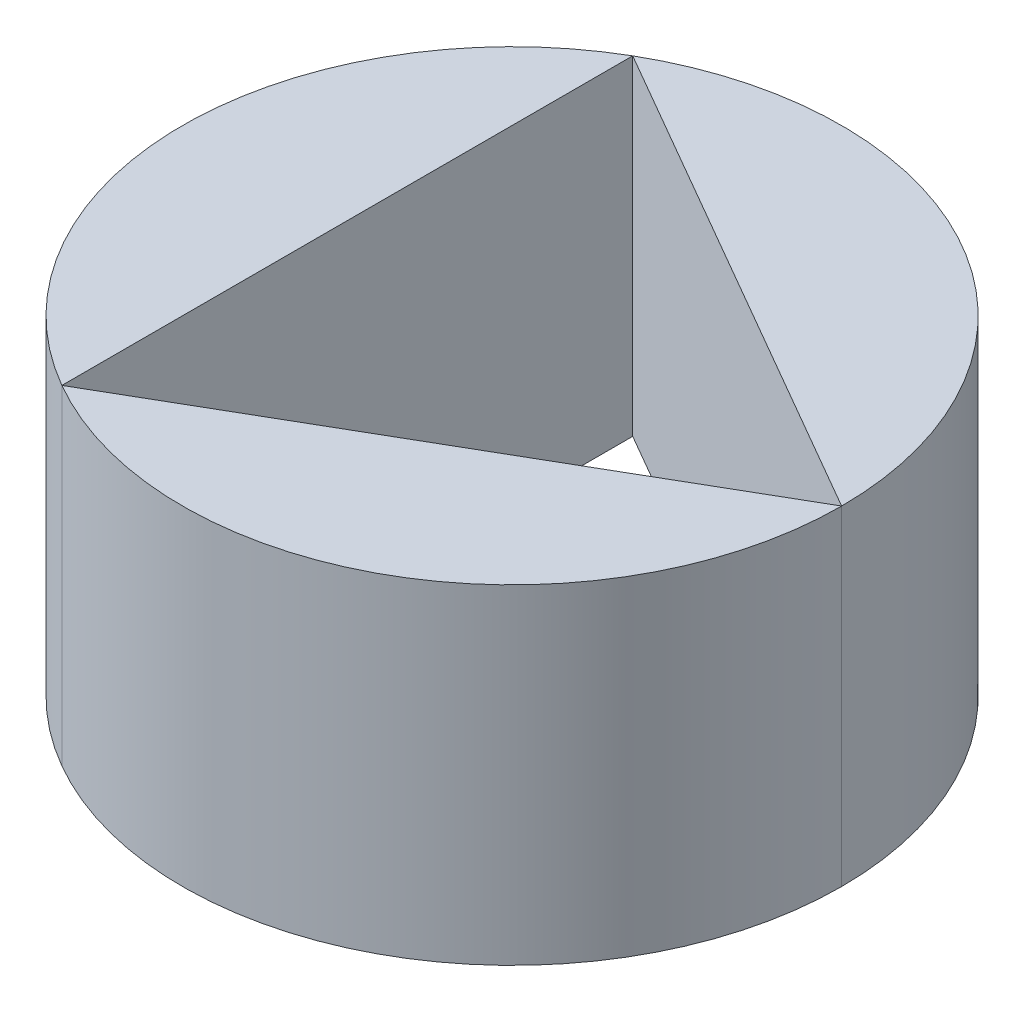
ISO-10303-21;
HEADER;
FILE_DESCRIPTION(('STEP AP214'),'2;1');
FILE_NAME('part.step','',(''),(''),'','','');
FILE_SCHEMA(('AUTOMOTIVE_DESIGN { 1 0 10303 214 1 1 1 1 }'));
ENDSEC;
DATA;
#1=APPLICATION_CONTEXT('core data for automotive mechanical design processes');
#2=APPLICATION_PROTOCOL_DEFINITION('international standard','automotive_design',2000,#1);
#3=PRODUCT_CONTEXT('',#1,'mechanical');
#4=PRODUCT('Part','Part','',(#3));
#5=PRODUCT_RELATED_PRODUCT_CATEGORY('part','',(#4));
#6=PRODUCT_DEFINITION_FORMATION('','',#4);
#7=PRODUCT_DEFINITION_CONTEXT('part definition',#1,'design');
#8=PRODUCT_DEFINITION('design','',#6,#7);
#9=PRODUCT_DEFINITION_SHAPE('','',#8);
#10=(LENGTH_UNIT() NAMED_UNIT(*) SI_UNIT(.MILLI.,.METRE.));
#11=(NAMED_UNIT(*) PLANE_ANGLE_UNIT() SI_UNIT($,.RADIAN.));
#12=(NAMED_UNIT(*) SI_UNIT($,.STERADIAN.) SOLID_ANGLE_UNIT());
#13=UNCERTAINTY_MEASURE_WITH_UNIT(LENGTH_MEASURE(1.E-05),#10,'distance_accuracy_value','');
#14=(GEOMETRIC_REPRESENTATION_CONTEXT(3) GLOBAL_UNCERTAINTY_ASSIGNED_CONTEXT((#13)) GLOBAL_UNIT_ASSIGNED_CONTEXT((#10,
#11,#12)) REPRESENTATION_CONTEXT('',''));
#15=CARTESIAN_POINT('',(0.,0.,0.));
#16=DIRECTION('',(0.,0.,1.));
#17=DIRECTION('',(1.,0.,0.));
#18=AXIS2_PLACEMENT_3D('',#15,#16,#17);
#19=CARTESIAN_POINT('',(0.,30.,0.));
#20=DIRECTION('',(0.,-1.,0.));
#21=DIRECTION('',(0.,0.,-1.));
#22=AXIS2_PLACEMENT_3D('',#19,#20,#21);
#23=CYLINDRICAL_SURFACE('',#22,30.);
#24=DIRECTION('',(0.,1.,0.));
#25=VECTOR('',#24,1.);
#26=CARTESIAN_POINT('',(-15.,0.,25.9807621135332));
#27=LINE('',#26,#25);
#28=CARTESIAN_POINT('',(-15.,0.,25.9807621135332));
#29=VERTEX_POINT('',#28);
#30=CARTESIAN_POINT('',(-15.,30.,25.9807621135332));
#31=VERTEX_POINT('',#30);
#32=EDGE_CURVE('E12',#29,#31,#27,.T.);
#33=ORIENTED_EDGE('',*,*,#32,.F.);
#34=CARTESIAN_POINT('',(0.,0.,0.));
#35=DIRECTION('',(0.,1.,0.));
#36=DIRECTION('',(0.,0.,1.));
#37=AXIS2_PLACEMENT_3D('',#34,#35,#36);
#38=CIRCLE('',#37,30.);
#39=CARTESIAN_POINT('',(30.,0.,0.));
#40=VERTEX_POINT('',#39);
#41=EDGE_CURVE('E80',#29,#40,#38,.T.);
#42=ORIENTED_EDGE('',*,*,#41,.T.);
#43=DIRECTION('',(0.,1.,0.));
#44=VECTOR('',#43,1.);
#45=CARTESIAN_POINT('',(30.,0.,0.));
#46=LINE('',#45,#44);
#47=CARTESIAN_POINT('',(30.,30.,0.));
#48=VERTEX_POINT('',#47);
#49=EDGE_CURVE('E72',#40,#48,#46,.T.);
#50=ORIENTED_EDGE('',*,*,#49,.T.);
#51=CARTESIAN_POINT('',(0.,30.,0.));
#52=DIRECTION('',(0.,1.,0.));
#53=DIRECTION('',(0.,0.,1.));
#54=AXIS2_PLACEMENT_3D('',#51,#52,#53);
#55=CIRCLE('',#54,30.);
#56=EDGE_CURVE('E51',#31,#48,#55,.T.);
#57=ORIENTED_EDGE('',*,*,#56,.F.);
#58=EDGE_LOOP('',(#33,#42,#50,#57));
#59=FACE_BOUND('',#58,.T.);
#60=ADVANCED_FACE('F48',(#59),#23,.T.);
#61=CARTESIAN_POINT('',(0.,30.,0.));
#62=DIRECTION('',(0.,1.,0.));
#63=DIRECTION('',(0.,0.,1.));
#64=AXIS2_PLACEMENT_3D('',#61,#62,#63);
#65=PLANE('',#64);
#66=DIRECTION('',(0.866025403784439,0.,-0.5));
#67=VECTOR('',#66,1.);
#68=CARTESIAN_POINT('',(-15.,30.,25.9807621135332));
#69=LINE('',#68,#67);
#70=EDGE_CURVE('E57',#31,#48,#69,.T.);
#71=ORIENTED_EDGE('',*,*,#70,.F.);
#72=ORIENTED_EDGE('',*,*,#56,.T.);
#73=EDGE_LOOP('',(#71,#72));
#74=FACE_BOUND('',#73,.T.);
#75=ADVANCED_FACE('F83',(#74),#65,.T.);
#76=CARTESIAN_POINT('',(0.,0.,0.));
#77=DIRECTION('',(0.,1.,0.));
#78=DIRECTION('',(0.,0.,1.));
#79=AXIS2_PLACEMENT_3D('',#76,#77,#78);
#80=PLANE('',#79);
#81=ORIENTED_EDGE('',*,*,#41,.F.);
#82=DIRECTION('',(0.866025403784439,0.,-0.5));
#83=VECTOR('',#82,1.);
#84=CARTESIAN_POINT('',(-15.,0.,25.9807621135332));
#85=LINE('',#84,#83);
#86=EDGE_CURVE('E76',#29,#40,#85,.T.);
#87=ORIENTED_EDGE('',*,*,#86,.T.);
#88=EDGE_LOOP('',(#81,#87));
#89=FACE_BOUND('',#88,.T.);
#90=ADVANCED_FACE('F86',(#89),#80,.F.);
#91=CARTESIAN_POINT('',(-15.,0.,25.9807621135332));
#92=DIRECTION('',(0.5,0.,0.866025403784438));
#93=DIRECTION('',(0.866025403784439,0.,-0.5));
#94=AXIS2_PLACEMENT_3D('',#91,#92,#93);
#95=PLANE('',#94);
#96=ORIENTED_EDGE('',*,*,#70,.T.);
#97=ORIENTED_EDGE('',*,*,#49,.F.);
#98=ORIENTED_EDGE('',*,*,#86,.F.);
#99=ORIENTED_EDGE('',*,*,#32,.T.);
#100=EDGE_LOOP('',(#96,#97,#98,#99));
#101=FACE_BOUND('',#100,.T.);
#102=ADVANCED_FACE('F71',(#101),#95,.F.);
#103=CLOSED_SHELL('',(#60,#75,#90,#102));
#104=MANIFOLD_SOLID_BREP('B2',#103);
#105=CARTESIAN_POINT('',(0.,0.,0.));
#106=DIRECTION('',(0.,1.,0.));
#107=DIRECTION('',(0.,0.,1.));
#108=AXIS2_PLACEMENT_3D('',#105,#106,#107);
#109=PLANE('',#108);
#110=CARTESIAN_POINT('',(0.,0.,0.));
#111=DIRECTION('',(0.,1.,0.));
#112=DIRECTION('',(0.,0.,1.));
#113=AXIS2_PLACEMENT_3D('',#110,#111,#112);
#114=CIRCLE('',#113,30.);
#115=CARTESIAN_POINT('',(30.,0.,0.));
#116=VERTEX_POINT('',#115);
#117=CARTESIAN_POINT('',(-15.,0.,-25.9807621135332));
#118=VERTEX_POINT('',#117);
#119=EDGE_CURVE('E141',#116,#118,#114,.T.);
#120=ORIENTED_EDGE('',*,*,#119,.F.);
#121=DIRECTION('',(-0.866025403784439,0.,-0.5));
#122=VECTOR('',#121,1.);
#123=CARTESIAN_POINT('',(30.,0.,0.));
#124=LINE('',#123,#122);
#125=EDGE_CURVE('E172',#116,#118,#124,.T.);
#126=ORIENTED_EDGE('',*,*,#125,.T.);
#127=EDGE_LOOP('',(#120,#126));
#128=FACE_BOUND('',#127,.T.);
#129=ADVANCED_FACE('F137',(#128),#109,.F.);
#130=CARTESIAN_POINT('',(0.,30.,0.));
#131=DIRECTION('',(0.,1.,0.));
#132=DIRECTION('',(0.,0.,1.));
#133=AXIS2_PLACEMENT_3D('',#130,#131,#132);
#134=PLANE('',#133);
#135=DIRECTION('',(-0.866025403784439,0.,-0.5));
#136=VECTOR('',#135,1.);
#137=CARTESIAN_POINT('',(30.,30.,0.));
#138=LINE('',#137,#136);
#139=CARTESIAN_POINT('',(30.,30.,0.));
#140=VERTEX_POINT('',#139);
#141=CARTESIAN_POINT('',(-15.,30.,-25.9807621135332));
#142=VERTEX_POINT('',#141);
#143=EDGE_CURVE('E46',#140,#142,#138,.T.);
#144=ORIENTED_EDGE('',*,*,#143,.F.);
#145=CARTESIAN_POINT('',(0.,30.,0.));
#146=DIRECTION('',(0.,1.,0.));
#147=DIRECTION('',(0.,0.,1.));
#148=AXIS2_PLACEMENT_3D('',#145,#146,#147);
#149=CIRCLE('',#148,30.);
#150=EDGE_CURVE('E167',#140,#142,#149,.T.);
#151=ORIENTED_EDGE('',*,*,#150,.T.);
#152=EDGE_LOOP('',(#144,#151));
#153=FACE_BOUND('',#152,.T.);
#154=ADVANCED_FACE('F171',(#153),#134,.T.);
#155=CARTESIAN_POINT('',(0.,30.,0.));
#156=DIRECTION('',(0.,-1.,0.));
#157=DIRECTION('',(0.,0.,-1.));
#158=AXIS2_PLACEMENT_3D('',#155,#156,#157);
#159=CYLINDRICAL_SURFACE('',#158,30.);
#160=ORIENTED_EDGE('',*,*,#150,.F.);
#161=DIRECTION('',(0.,-1.,0.));
#162=VECTOR('',#161,1.);
#163=CARTESIAN_POINT('',(30.,30.,0.));
#164=LINE('',#163,#162);
#165=EDGE_CURVE('E154',#140,#116,#164,.T.);
#166=ORIENTED_EDGE('',*,*,#165,.T.);
#167=ORIENTED_EDGE('',*,*,#119,.T.);
#168=DIRECTION('',(0.,-1.,0.));
#169=VECTOR('',#168,1.);
#170=CARTESIAN_POINT('',(-15.,30.,-25.9807621135332));
#171=LINE('',#170,#169);
#172=EDGE_CURVE('E147',#118,#142,#171,.F.);
#173=ORIENTED_EDGE('',*,*,#172,.T.);
#174=EDGE_LOOP('',(#160,#166,#167,#173));
#175=FACE_BOUND('',#174,.T.);
#176=ADVANCED_FACE('F139',(#175),#159,.T.);
#177=CARTESIAN_POINT('',(30.,0.,0.));
#178=DIRECTION('',(0.5,0.,-0.866025403784439));
#179=DIRECTION('',(-0.866025403784439,0.,-0.5));
#180=AXIS2_PLACEMENT_3D('',#177,#178,#179);
#181=PLANE('',#180);
#182=ORIENTED_EDGE('',*,*,#143,.T.);
#183=ORIENTED_EDGE('',*,*,#172,.F.);
#184=ORIENTED_EDGE('',*,*,#125,.F.);
#185=ORIENTED_EDGE('',*,*,#165,.F.);
#186=EDGE_LOOP('',(#182,#183,#184,#185));
#187=FACE_BOUND('',#186,.T.);
#188=ADVANCED_FACE('F162',(#187),#181,.F.);
#189=CLOSED_SHELL('',(#129,#154,#176,#188));
#190=MANIFOLD_SOLID_BREP('B6',#189);
#191=CARTESIAN_POINT('',(0.,30.,0.));
#192=DIRECTION('',(0.,1.,0.));
#193=DIRECTION('',(0.,0.,1.));
#194=AXIS2_PLACEMENT_3D('',#191,#192,#193);
#195=PLANE('',#194);
#196=DIRECTION('',(0.,0.,1.));
#197=VECTOR('',#196,1.);
#198=CARTESIAN_POINT('',(-15.,30.,-25.9807621135332));
#199=LINE('',#198,#197);
#200=CARTESIAN_POINT('',(-15.,30.,-25.9807621135332));
#201=VERTEX_POINT('',#200);
#202=CARTESIAN_POINT('',(-15.,30.,25.9807621135332));
#203=VERTEX_POINT('',#202);
#204=EDGE_CURVE('E241',#201,#203,#199,.T.);
#205=ORIENTED_EDGE('',*,*,#204,.F.);
#206=CARTESIAN_POINT('',(0.,30.,0.));
#207=DIRECTION('',(0.,1.,0.));
#208=DIRECTION('',(0.,0.,1.));
#209=AXIS2_PLACEMENT_3D('',#206,#207,#208);
#210=CIRCLE('',#209,30.);
#211=EDGE_CURVE('E225',#201,#203,#210,.T.);
#212=ORIENTED_EDGE('',*,*,#211,.T.);
#213=EDGE_LOOP('',(#205,#212));
#214=FACE_BOUND('',#213,.T.);
#215=ADVANCED_FACE('F217',(#214),#195,.T.);
#216=CARTESIAN_POINT('',(0.,0.,0.));
#217=DIRECTION('',(0.,1.,0.));
#218=DIRECTION('',(0.,0.,1.));
#219=AXIS2_PLACEMENT_3D('',#216,#217,#218);
#220=PLANE('',#219);
#221=CARTESIAN_POINT('',(0.,0.,0.));
#222=DIRECTION('',(0.,1.,0.));
#223=DIRECTION('',(0.,0.,1.));
#224=AXIS2_PLACEMENT_3D('',#221,#222,#223);
#225=CIRCLE('',#224,30.);
#226=CARTESIAN_POINT('',(-15.,0.,-25.9807621135332));
#227=VERTEX_POINT('',#226);
#228=CARTESIAN_POINT('',(-15.,0.,25.9807621135332));
#229=VERTEX_POINT('',#228);
#230=EDGE_CURVE('E249',#227,#229,#225,.T.);
#231=ORIENTED_EDGE('',*,*,#230,.F.);
#232=DIRECTION('',(0.,0.,1.));
#233=VECTOR('',#232,1.);
#234=CARTESIAN_POINT('',(-15.,0.,-25.9807621135332));
#235=LINE('',#234,#233);
#236=EDGE_CURVE('E245',#227,#229,#235,.T.);
#237=ORIENTED_EDGE('',*,*,#236,.T.);
#238=EDGE_LOOP('',(#231,#237));
#239=FACE_BOUND('',#238,.T.);
#240=ADVANCED_FACE('F255',(#239),#220,.F.);
#241=CARTESIAN_POINT('',(0.,30.,0.));
#242=DIRECTION('',(0.,-1.,0.));
#243=DIRECTION('',(0.,0.,-1.));
#244=AXIS2_PLACEMENT_3D('',#241,#242,#243);
#245=CYLINDRICAL_SURFACE('',#244,30.);
#246=ORIENTED_EDGE('',*,*,#230,.T.);
#247=DIRECTION('',(0.,-1.,0.));
#248=VECTOR('',#247,1.);
#249=CARTESIAN_POINT('',(-15.,30.,25.9807621135332));
#250=LINE('',#249,#248);
#251=EDGE_CURVE('E135',#229,#203,#250,.F.);
#252=ORIENTED_EDGE('',*,*,#251,.T.);
#253=ORIENTED_EDGE('',*,*,#211,.F.);
#254=DIRECTION('',(0.,1.,0.));
#255=VECTOR('',#254,1.);
#256=CARTESIAN_POINT('',(-15.,0.,-25.9807621135332));
#257=LINE('',#256,#255);
#258=EDGE_CURVE('E235',#227,#201,#257,.T.);
#259=ORIENTED_EDGE('',*,*,#258,.F.);
#260=EDGE_LOOP('',(#246,#252,#253,#259));
#261=FACE_BOUND('',#260,.T.);
#262=ADVANCED_FACE('F219',(#261),#245,.T.);
#263=CARTESIAN_POINT('',(-15.,0.,-25.9807621135332));
#264=DIRECTION('',(-1.,0.,0.));
#265=DIRECTION('',(0.,0.,1.));
#266=AXIS2_PLACEMENT_3D('',#263,#264,#265);
#267=PLANE('',#266);
#268=ORIENTED_EDGE('',*,*,#204,.T.);
#269=ORIENTED_EDGE('',*,*,#251,.F.);
#270=ORIENTED_EDGE('',*,*,#236,.F.);
#271=ORIENTED_EDGE('',*,*,#258,.T.);
#272=EDGE_LOOP('',(#268,#269,#270,#271));
#273=FACE_BOUND('',#272,.T.);
#274=ADVANCED_FACE('F242',(#273),#267,.F.);
#275=CLOSED_SHELL('',(#215,#240,#262,#274));
#276=MANIFOLD_SOLID_BREP('B40',#275);
#277=ADVANCED_BREP_SHAPE_REPRESENTATION('',(#18,#104,#190,#276),#14);
#278=SHAPE_DEFINITION_REPRESENTATION(#9,#277);
ENDSEC;
END-ISO-10303-21;
